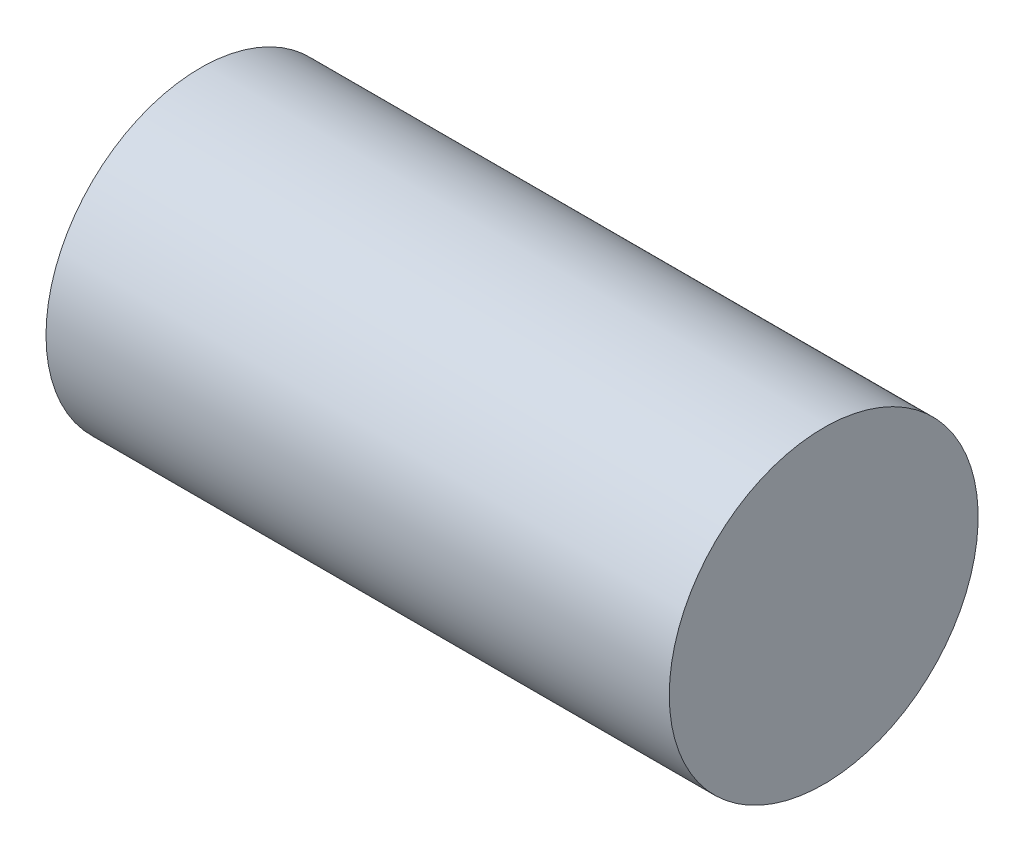
ISO-10303-21;
HEADER;
FILE_DESCRIPTION(('STEP AP214'),'2;1');
FILE_NAME('part.step','',(''),(''),'','','');
FILE_SCHEMA(('AUTOMOTIVE_DESIGN { 1 0 10303 214 1 1 1 1 }'));
ENDSEC;
DATA;
#1=APPLICATION_CONTEXT('core data for automotive mechanical design processes');
#2=APPLICATION_PROTOCOL_DEFINITION('international standard','automotive_design',2000,#1);
#3=PRODUCT_CONTEXT('',#1,'mechanical');
#4=PRODUCT('Part','Part','',(#3));
#5=PRODUCT_RELATED_PRODUCT_CATEGORY('part','',(#4));
#6=PRODUCT_DEFINITION_FORMATION('','',#4);
#7=PRODUCT_DEFINITION_CONTEXT('part definition',#1,'design');
#8=PRODUCT_DEFINITION('design','',#6,#7);
#9=PRODUCT_DEFINITION_SHAPE('','',#8);
#10=(LENGTH_UNIT() NAMED_UNIT(*) SI_UNIT(.MILLI.,.METRE.));
#11=(NAMED_UNIT(*) PLANE_ANGLE_UNIT() SI_UNIT($,.RADIAN.));
#12=(NAMED_UNIT(*) SI_UNIT($,.STERADIAN.) SOLID_ANGLE_UNIT());
#13=UNCERTAINTY_MEASURE_WITH_UNIT(LENGTH_MEASURE(1.E-05),#10,'distance_accuracy_value','');
#14=(GEOMETRIC_REPRESENTATION_CONTEXT(3) GLOBAL_UNCERTAINTY_ASSIGNED_CONTEXT((#13)) GLOBAL_UNIT_ASSIGNED_CONTEXT((#10,
#11,#12)) REPRESENTATION_CONTEXT('',''));
#15=CARTESIAN_POINT('',(0.,0.,0.));
#16=DIRECTION('',(0.,0.,1.));
#17=DIRECTION('',(1.,0.,0.));
#18=AXIS2_PLACEMENT_3D('',#15,#16,#17);
#19=CARTESIAN_POINT('',(0.,37.1323375908757,0.));
#20=DIRECTION('',(1.,0.,0.));
#21=DIRECTION('',(0.,0.,-1.));
#22=AXIS2_PLACEMENT_3D('',#19,#20,#21);
#23=PLANE('',#22);
#24=CARTESIAN_POINT('',(0.,0.,0.));
#25=DIRECTION('',(-1.,0.,0.));
#26=DIRECTION('',(0.,0.,1.));
#27=AXIS2_PLACEMENT_3D('',#24,#25,#26);
#28=CIRCLE('',#27,37.1323375908757);
#29=CARTESIAN_POINT('',(0.,0.,37.1323375908757));
#30=VERTEX_POINT('',#29);
#31=EDGE_CURVE('E50',#30,#30,#28,.T.);
#32=ORIENTED_EDGE('',*,*,#31,.T.);
#33=EDGE_LOOP('',(#32));
#34=FACE_BOUND('',#33,.T.);
#35=ADVANCED_FACE('F43',(#34),#23,.F.);
#36=CARTESIAN_POINT('',(149.855505277463,0.,0.));
#37=DIRECTION('',(-1.,0.,0.));
#38=DIRECTION('',(0.,0.,1.));
#39=AXIS2_PLACEMENT_3D('',#36,#37,#38);
#40=PLANE('',#39);
#41=CARTESIAN_POINT('',(149.855505277463,0.,0.));
#42=DIRECTION('',(-1.,0.,0.));
#43=DIRECTION('',(0.,0.,1.));
#44=AXIS2_PLACEMENT_3D('',#41,#42,#43);
#45=CIRCLE('',#44,37.1323375908757);
#46=CARTESIAN_POINT('',(149.855505277463,0.,37.1323375908757));
#47=VERTEX_POINT('',#46);
#48=EDGE_CURVE('E10',#47,#47,#45,.T.);
#49=ORIENTED_EDGE('',*,*,#48,.F.);
#50=EDGE_LOOP('',(#49));
#51=FACE_BOUND('',#50,.T.);
#52=ADVANCED_FACE('F60',(#51),#40,.F.);
#53=CARTESIAN_POINT('',(0.,0.,0.));
#54=DIRECTION('',(-1.,0.,0.));
#55=DIRECTION('',(0.,0.,1.));
#56=AXIS2_PLACEMENT_3D('',#53,#54,#55);
#57=CYLINDRICAL_SURFACE('',#56,37.1323375908757);
#58=ORIENTED_EDGE('',*,*,#31,.F.);
#59=EDGE_LOOP('',(#58));
#60=FACE_BOUND('',#59,.T.);
#61=ORIENTED_EDGE('',*,*,#48,.T.);
#62=EDGE_LOOP('',(#61));
#63=FACE_BOUND('',#62,.T.);
#64=ADVANCED_FACE('F58',(#60,#63),#57,.T.);
#65=CLOSED_SHELL('',(#35,#52,#64));
#66=MANIFOLD_SOLID_BREP('B2',#65);
#67=ADVANCED_BREP_SHAPE_REPRESENTATION('',(#18,#66),#14);
#68=SHAPE_DEFINITION_REPRESENTATION(#9,#67);
ENDSEC;
END-ISO-10303-21;
